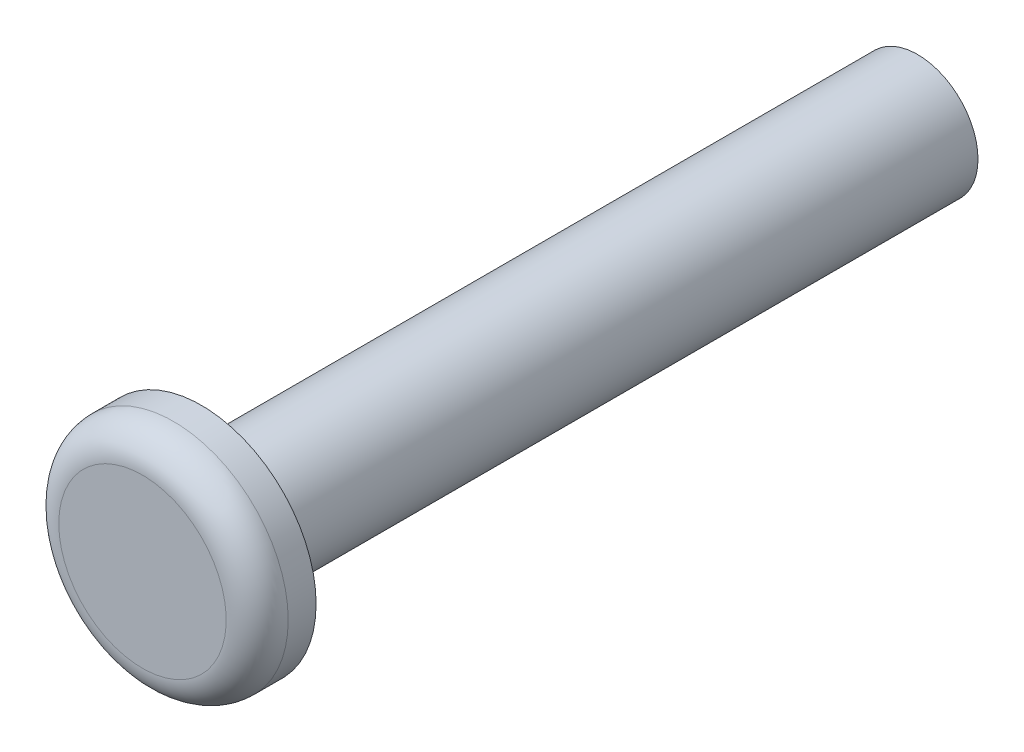
ISO-10303-21;
HEADER;
FILE_DESCRIPTION(('STEP AP214'),'2;1');
FILE_NAME('part.step','',(''),(''),'','','');
FILE_SCHEMA(('AUTOMOTIVE_DESIGN { 1 0 10303 214 1 1 1 1 }'));
ENDSEC;
DATA;
#1=APPLICATION_CONTEXT('core data for automotive mechanical design processes');
#2=APPLICATION_PROTOCOL_DEFINITION('international standard','automotive_design',2000,#1);
#3=PRODUCT_CONTEXT('',#1,'mechanical');
#4=PRODUCT('Part','Part','',(#3));
#5=PRODUCT_RELATED_PRODUCT_CATEGORY('part','',(#4));
#6=PRODUCT_DEFINITION_FORMATION('','',#4);
#7=PRODUCT_DEFINITION_CONTEXT('part definition',#1,'design');
#8=PRODUCT_DEFINITION('design','',#6,#7);
#9=PRODUCT_DEFINITION_SHAPE('','',#8);
#10=(LENGTH_UNIT() NAMED_UNIT(*) SI_UNIT(.MILLI.,.METRE.));
#11=(NAMED_UNIT(*) PLANE_ANGLE_UNIT() SI_UNIT($,.RADIAN.));
#12=(NAMED_UNIT(*) SI_UNIT($,.STERADIAN.) SOLID_ANGLE_UNIT());
#13=UNCERTAINTY_MEASURE_WITH_UNIT(LENGTH_MEASURE(1.E-05),#10,'distance_accuracy_value','');
#14=(GEOMETRIC_REPRESENTATION_CONTEXT(3) GLOBAL_UNCERTAINTY_ASSIGNED_CONTEXT((#13)) GLOBAL_UNIT_ASSIGNED_CONTEXT((#10,
#11,#12)) REPRESENTATION_CONTEXT('',''));
#15=CARTESIAN_POINT('',(0.,0.,0.));
#16=DIRECTION('',(0.,0.,1.));
#17=DIRECTION('',(1.,0.,0.));
#18=AXIS2_PLACEMENT_3D('',#15,#16,#17);
#19=CARTESIAN_POINT('',(0.,3.7,0.));
#20=DIRECTION('',(0.,0.,-1.));
#21=DIRECTION('',(-1.,0.,0.));
#22=AXIS2_PLACEMENT_3D('',#19,#20,#21);
#23=PLANE('',#22);
#24=CARTESIAN_POINT('',(0.,0.,0.));
#25=DIRECTION('',(0.,0.,-1.));
#26=DIRECTION('',(-1.,0.,0.));
#27=AXIS2_PLACEMENT_3D('',#24,#25,#26);
#28=CIRCLE('',#27,2.7);
#29=CARTESIAN_POINT('',(-2.7,0.,0.));
#30=VERTEX_POINT('',#29);
#31=EDGE_CURVE('E37',#30,#30,#28,.F.);
#32=ORIENTED_EDGE('',*,*,#31,.T.);
#33=EDGE_LOOP('',(#32));
#34=FACE_BOUND('',#33,.T.);
#35=ADVANCED_FACE('F30',(#34),#23,.F.);
#36=CARTESIAN_POINT('',(0.,0.,-25.));
#37=DIRECTION('',(0.,0.,1.));
#38=DIRECTION('',(1.,0.,0.));
#39=AXIS2_PLACEMENT_3D('',#36,#37,#38);
#40=PLANE('',#39);
#41=CARTESIAN_POINT('',(0.,0.,-25.));
#42=DIRECTION('',(0.,0.,1.));
#43=DIRECTION('',(1.,0.,0.));
#44=AXIS2_PLACEMENT_3D('',#41,#42,#43);
#45=CIRCLE('',#44,1.95);
#46=CARTESIAN_POINT('',(1.95,0.,-25.));
#47=VERTEX_POINT('',#46);
#48=EDGE_CURVE('E41',#47,#47,#45,.T.);
#49=ORIENTED_EDGE('',*,*,#48,.F.);
#50=EDGE_LOOP('',(#49));
#51=FACE_BOUND('',#50,.T.);
#52=ADVANCED_FACE('F65',(#51),#40,.F.);
#53=CARTESIAN_POINT('',(0.,0.,0.));
#54=DIRECTION('',(0.,0.,1.));
#55=DIRECTION('',(1.,0.,0.));
#56=AXIS2_PLACEMENT_3D('',#53,#54,#55);
#57=CYLINDRICAL_SURFACE('',#56,1.95);
#58=CARTESIAN_POINT('',(0.,0.,-1.9));
#59=DIRECTION('',(0.,0.,1.));
#60=DIRECTION('',(1.,0.,0.));
#61=AXIS2_PLACEMENT_3D('',#58,#59,#60);
#62=CIRCLE('',#61,1.95);
#63=CARTESIAN_POINT('',(1.95,0.,-1.9));
#64=VERTEX_POINT('',#63);
#65=EDGE_CURVE('E45',#64,#64,#62,.T.);
#66=ORIENTED_EDGE('',*,*,#65,.F.);
#67=EDGE_LOOP('',(#66));
#68=FACE_BOUND('',#67,.T.);
#69=ORIENTED_EDGE('',*,*,#48,.T.);
#70=EDGE_LOOP('',(#69));
#71=FACE_BOUND('',#70,.T.);
#72=ADVANCED_FACE('F59',(#68,#71),#57,.T.);
#73=CARTESIAN_POINT('',(0.,1.95,-1.9));
#74=DIRECTION('',(0.,0.,1.));
#75=DIRECTION('',(1.,0.,0.));
#76=AXIS2_PLACEMENT_3D('',#73,#74,#75);
#77=PLANE('',#76);
#78=CARTESIAN_POINT('',(0.,0.,-1.9));
#79=DIRECTION('',(0.,0.,1.));
#80=DIRECTION('',(1.,0.,0.));
#81=AXIS2_PLACEMENT_3D('',#78,#79,#80);
#82=CIRCLE('',#81,3.7);
#83=CARTESIAN_POINT('',(3.7,0.,-1.9));
#84=VERTEX_POINT('',#83);
#85=EDGE_CURVE('E50',#84,#84,#82,.T.);
#86=ORIENTED_EDGE('',*,*,#85,.F.);
#87=EDGE_LOOP('',(#86));
#88=FACE_BOUND('',#87,.T.);
#89=ORIENTED_EDGE('',*,*,#65,.T.);
#90=EDGE_LOOP('',(#89));
#91=FACE_BOUND('',#90,.T.);
#92=ADVANCED_FACE('F56',(#88,#91),#77,.F.);
#93=CARTESIAN_POINT('',(0.,0.,0.));
#94=DIRECTION('',(0.,0.,1.));
#95=DIRECTION('',(1.,0.,0.));
#96=AXIS2_PLACEMENT_3D('',#93,#94,#95);
#97=CYLINDRICAL_SURFACE('',#96,3.7);
#98=CARTESIAN_POINT('',(0.,0.,-1.));
#99=DIRECTION('',(0.,0.,-1.));
#100=DIRECTION('',(-1.,0.,0.));
#101=AXIS2_PLACEMENT_3D('',#98,#99,#100);
#102=CIRCLE('',#101,3.7);
#103=CARTESIAN_POINT('',(-3.7,0.,-1.));
#104=VERTEX_POINT('',#103);
#105=EDGE_CURVE('E10',#104,#104,#102,.T.);
#106=ORIENTED_EDGE('',*,*,#105,.T.);
#107=EDGE_LOOP('',(#106));
#108=FACE_BOUND('',#107,.T.);
#109=ORIENTED_EDGE('',*,*,#85,.T.);
#110=EDGE_LOOP('',(#109));
#111=FACE_BOUND('',#110,.T.);
#112=ADVANCED_FACE('F54',(#108,#111),#97,.T.);
#113=CARTESIAN_POINT('',(0.,0.,-1.));
#114=DIRECTION('',(0.,0.,-1.));
#115=DIRECTION('',(-1.,0.,0.));
#116=AXIS2_PLACEMENT_3D('',#113,#114,#115);
#117=TOROIDAL_SURFACE('',#116,2.7,1.);
#118=ORIENTED_EDGE('',*,*,#105,.F.);
#119=EDGE_LOOP('',(#118));
#120=FACE_BOUND('',#119,.T.);
#121=ORIENTED_EDGE('',*,*,#31,.F.);
#122=EDGE_LOOP('',(#121));
#123=FACE_BOUND('',#122,.T.);
#124=ADVANCED_FACE('F32',(#120,#123),#117,.T.);
#125=CLOSED_SHELL('',(#35,#52,#72,#92,#112,#124));
#126=MANIFOLD_SOLID_BREP('B2',#125);
#127=ADVANCED_BREP_SHAPE_REPRESENTATION('',(#18,#126),#14);
#128=SHAPE_DEFINITION_REPRESENTATION(#9,#127);
ENDSEC;
END-ISO-10303-21;
